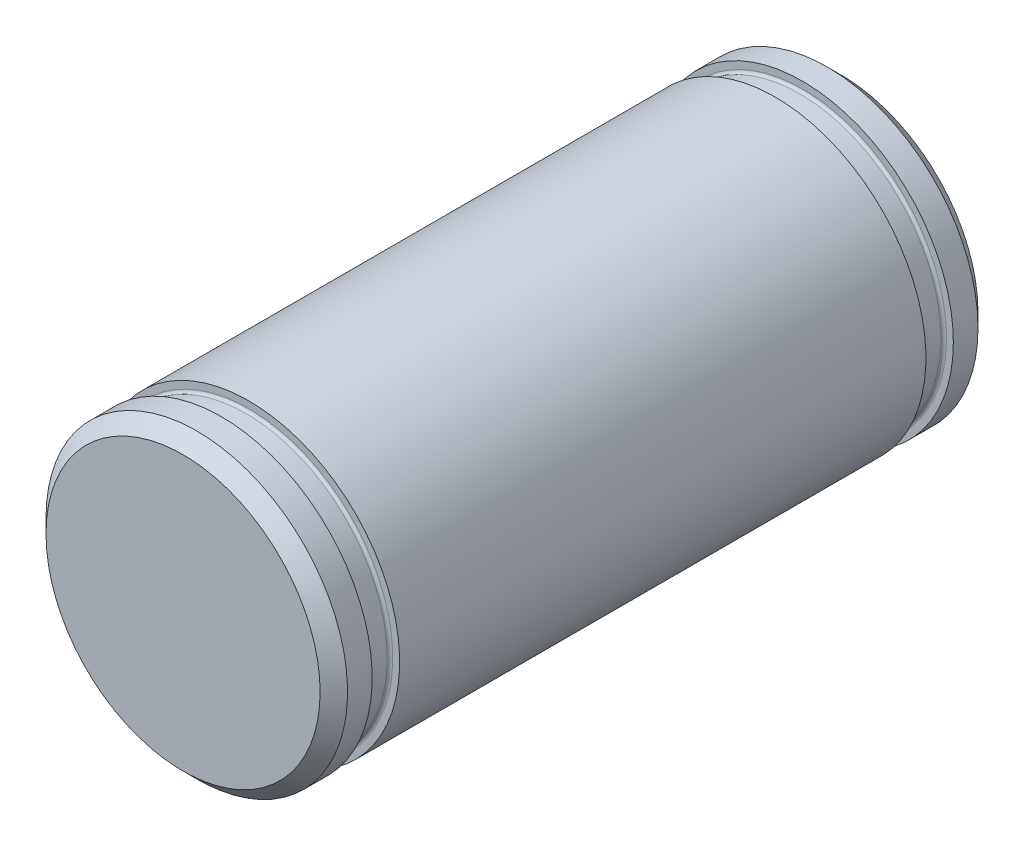
ISO-10303-21;
HEADER;
FILE_DESCRIPTION(('STEP AP214'),'2;1');
FILE_NAME('part.step','',(''),(''),'','','');
FILE_SCHEMA(('AUTOMOTIVE_DESIGN { 1 0 10303 214 1 1 1 1 }'));
ENDSEC;
DATA;
#1=APPLICATION_CONTEXT('core data for automotive mechanical design processes');
#2=APPLICATION_PROTOCOL_DEFINITION('international standard','automotive_design',2000,#1);
#3=PRODUCT_CONTEXT('',#1,'mechanical');
#4=PRODUCT('Part','Part','',(#3));
#5=PRODUCT_RELATED_PRODUCT_CATEGORY('part','',(#4));
#6=PRODUCT_DEFINITION_FORMATION('','',#4);
#7=PRODUCT_DEFINITION_CONTEXT('part definition',#1,'design');
#8=PRODUCT_DEFINITION('design','',#6,#7);
#9=PRODUCT_DEFINITION_SHAPE('','',#8);
#10=(LENGTH_UNIT() NAMED_UNIT(*) SI_UNIT(.MILLI.,.METRE.));
#11=(NAMED_UNIT(*) PLANE_ANGLE_UNIT() SI_UNIT($,.RADIAN.));
#12=(NAMED_UNIT(*) SI_UNIT($,.STERADIAN.) SOLID_ANGLE_UNIT());
#13=UNCERTAINTY_MEASURE_WITH_UNIT(LENGTH_MEASURE(1.E-05),#10,'distance_accuracy_value','');
#14=(GEOMETRIC_REPRESENTATION_CONTEXT(3) GLOBAL_UNCERTAINTY_ASSIGNED_CONTEXT((#13)) GLOBAL_UNIT_ASSIGNED_CONTEXT((#10,
#11,#12)) REPRESENTATION_CONTEXT('',''));
#15=CARTESIAN_POINT('',(0.,0.,0.));
#16=DIRECTION('',(0.,0.,1.));
#17=DIRECTION('',(1.,0.,0.));
#18=AXIS2_PLACEMENT_3D('',#15,#16,#17);
#19=CARTESIAN_POINT('',(0.,0.,12.));
#20=DIRECTION('',(0.,0.,-1.));
#21=DIRECTION('',(-1.,0.,0.));
#22=AXIS2_PLACEMENT_3D('',#19,#20,#21);
#23=CYLINDRICAL_SURFACE('',#22,5.5);
#24=CARTESIAN_POINT('',(0.,0.,9.6));
#25=DIRECTION('',(0.,0.,1.));
#26=DIRECTION('',(1.,0.,0.));
#27=AXIS2_PLACEMENT_3D('',#24,#25,#26);
#28=CIRCLE('',#27,5.5);
#29=CARTESIAN_POINT('',(-5.50000000000001,0.,9.6));
#30=VERTEX_POINT('',#29);
#31=EDGE_CURVE('E48',#30,#30,#28,.T.);
#32=CARTESIAN_POINT('',(0.,0.,-9.59999999999998));
#33=DIRECTION('',(0.,0.,-1.));
#34=DIRECTION('',(-1.,0.,0.));
#35=AXIS2_PLACEMENT_3D('',#32,#33,#34);
#36=CIRCLE('',#35,5.5);
#37=CARTESIAN_POINT('',(-5.50000000000001,0.,-9.59999999999999));
#38=VERTEX_POINT('',#37);
#39=EDGE_CURVE('E55',#38,#38,#36,.T.);
#40=CARTESIAN_POINT('',(-5.50000000000001,0.,9.6));
#41=CARTESIAN_POINT('',(-5.50000000000001,0.,9.4));
#42=CARTESIAN_POINT('',(-5.50000000000001,0.,9.2));
#43=CARTESIAN_POINT('',(-5.50000000000001,0.,8.8));
#44=CARTESIAN_POINT('',(-5.50000000000001,0.,8.6));
#45=CARTESIAN_POINT('',(-5.50000000000001,0.,8.2));
#46=CARTESIAN_POINT('',(-5.50000000000001,0.,8.));
#47=CARTESIAN_POINT('',(-5.50000000000001,0.,7.6));
#48=CARTESIAN_POINT('',(-5.50000000000001,0.,7.4));
#49=CARTESIAN_POINT('',(-5.50000000000001,0.,7.));
#50=CARTESIAN_POINT('',(-5.50000000000001,0.,6.8));
#51=CARTESIAN_POINT('',(-5.50000000000001,0.,6.4));
#52=CARTESIAN_POINT('',(-5.50000000000001,0.,6.2));
#53=CARTESIAN_POINT('',(-5.50000000000001,0.,5.8));
#54=CARTESIAN_POINT('',(-5.50000000000001,0.,5.6));
#55=CARTESIAN_POINT('',(-5.50000000000001,0.,5.2));
#56=CARTESIAN_POINT('',(-5.50000000000001,0.,5.));
#57=CARTESIAN_POINT('',(-5.50000000000001,0.,4.6));
#58=CARTESIAN_POINT('',(-5.50000000000001,0.,4.4));
#59=CARTESIAN_POINT('',(-5.50000000000001,0.,4.));
#60=CARTESIAN_POINT('',(-5.50000000000001,0.,3.8));
#61=CARTESIAN_POINT('',(-5.50000000000001,0.,3.4));
#62=CARTESIAN_POINT('',(-5.50000000000001,0.,3.2));
#63=CARTESIAN_POINT('',(-5.50000000000001,0.,2.8));
#64=CARTESIAN_POINT('',(-5.50000000000001,0.,2.6));
#65=CARTESIAN_POINT('',(-5.50000000000001,0.,2.2));
#66=CARTESIAN_POINT('',(-5.50000000000001,0.,2.));
#67=CARTESIAN_POINT('',(-5.50000000000001,0.,1.6));
#68=CARTESIAN_POINT('',(-5.50000000000001,0.,1.4));
#69=CARTESIAN_POINT('',(-5.50000000000001,0.,1.));
#70=CARTESIAN_POINT('',(-5.50000000000001,0.,0.800000000000003));
#71=CARTESIAN_POINT('',(-5.50000000000001,0.,0.400000000000003));
#72=CARTESIAN_POINT('',(-5.50000000000001,0.,0.200000000000003));
#73=CARTESIAN_POINT('',(-5.50000000000001,0.,-0.199999999999996));
#74=CARTESIAN_POINT('',(-5.50000000000001,0.,-0.399999999999996));
#75=CARTESIAN_POINT('',(-5.50000000000001,0.,-0.799999999999996));
#76=CARTESIAN_POINT('',(-5.50000000000001,0.,-0.999999999999996));
#77=CARTESIAN_POINT('',(-5.50000000000001,0.,-1.4));
#78=CARTESIAN_POINT('',(-5.50000000000001,0.,-1.59999999999999));
#79=CARTESIAN_POINT('',(-5.50000000000001,0.,-1.99999999999999));
#80=CARTESIAN_POINT('',(-5.50000000000001,0.,-2.19999999999999));
#81=CARTESIAN_POINT('',(-5.50000000000001,0.,-2.59999999999999));
#82=CARTESIAN_POINT('',(-5.50000000000001,0.,-2.79999999999999));
#83=CARTESIAN_POINT('',(-5.50000000000001,0.,-3.19999999999999));
#84=CARTESIAN_POINT('',(-5.50000000000001,0.,-3.39999999999999));
#85=CARTESIAN_POINT('',(-5.50000000000001,0.,-3.79999999999999));
#86=CARTESIAN_POINT('',(-5.50000000000001,0.,-3.99999999999999));
#87=CARTESIAN_POINT('',(-5.50000000000001,0.,-4.39999999999999));
#88=CARTESIAN_POINT('',(-5.50000000000001,0.,-4.59999999999999));
#89=CARTESIAN_POINT('',(-5.50000000000001,0.,-4.99999999999999));
#90=CARTESIAN_POINT('',(-5.50000000000001,0.,-5.19999999999999));
#91=CARTESIAN_POINT('',(-5.50000000000001,0.,-5.59999999999999));
#92=CARTESIAN_POINT('',(-5.50000000000001,0.,-5.79999999999999));
#93=CARTESIAN_POINT('',(-5.50000000000001,0.,-6.19999999999999));
#94=CARTESIAN_POINT('',(-5.50000000000001,0.,-6.39999999999999));
#95=CARTESIAN_POINT('',(-5.50000000000001,0.,-6.79999999999999));
#96=CARTESIAN_POINT('',(-5.50000000000001,0.,-6.99999999999999));
#97=CARTESIAN_POINT('',(-5.50000000000001,0.,-7.39999999999999));
#98=CARTESIAN_POINT('',(-5.50000000000001,0.,-7.59999999999999));
#99=CARTESIAN_POINT('',(-5.50000000000001,0.,-7.99999999999999));
#100=CARTESIAN_POINT('',(-5.50000000000001,0.,-8.19999999999999));
#101=CARTESIAN_POINT('',(-5.50000000000001,0.,-8.59999999999999));
#102=CARTESIAN_POINT('',(-5.50000000000001,0.,-8.79999999999999));
#103=CARTESIAN_POINT('',(-5.50000000000001,0.,-9.19999999999999));
#104=CARTESIAN_POINT('',(-5.50000000000001,0.,-9.39999999999999));
#105=CARTESIAN_POINT('',(-5.50000000000001,0.,-9.59999999999999));
#106=B_SPLINE_CURVE_WITH_KNOTS('',3,(#40,#41,#42,#43,#44,#45,#46,#47,#48,#49,#50,#51,#52,#53,
#54,#55,#56,#57,#58,#59,#60,#61,#62,#63,#64,#65,#66,#67,#68,#69,#70,#71,#72,#73,#74,#75,#76,#77,
#78,#79,#80,#81,#82,#83,#84,#85,#86,#87,#88,#89,#90,#91,#92,#93,#94,#95,#96,#97,#98,#99,#100,
#101,#102,#103,#104,#105),.UNSPECIFIED.,.F.,.F.,(4,2,2,2,2,2,2,2,2,2,2,2,2,2,2,2,2,2,2,2,2,2,2,
2,2,2,2,2,2,2,2,2,4),(0.,0.6,1.2,1.8,2.4,3.,3.6,4.2,4.8,5.4,6.,6.6,7.2,7.79999999999999,8.4,
8.99999999999999,9.59999999999999,10.2,10.8,11.4,12.,12.6,13.2,13.8,14.4,15.,15.6,16.2,16.8,
17.4,18.,18.6,19.2),.UNSPECIFIED.);
#107=EDGE_CURVE('BSEAM31',#30,#38,#106,.T.);
#108=ORIENTED_EDGE('',*,*,#31,.F.);
#109=ORIENTED_EDGE('',*,*,#39,.F.);
#110=ORIENTED_EDGE('',*,*,#107,.T.);
#111=ORIENTED_EDGE('',*,*,#107,.F.);
#112=EDGE_LOOP('',(#108,#110,#109,#111));
#113=FACE_BOUND('',#112,.T.);
#114=ADVANCED_FACE('F31',(#113),#23,.T.);
#115=CARTESIAN_POINT('',(0.,0.,11.5));
#116=DIRECTION('',(0.,0.,1.));
#117=DIRECTION('',(1.,0.,0.));
#118=AXIS2_PLACEMENT_3D('',#115,#116,#117);
#119=CIRCLE('',#118,5.5);
#120=CARTESIAN_POINT('',(-5.50000000000001,0.,11.5));
#121=VERTEX_POINT('',#120);
#122=EDGE_CURVE('E44',#121,#121,#119,.F.);
#123=CARTESIAN_POINT('',(0.,0.,10.6));
#124=DIRECTION('',(0.,0.,-1.));
#125=DIRECTION('',(-1.,0.,0.));
#126=AXIS2_PLACEMENT_3D('',#123,#124,#125);
#127=CIRCLE('',#126,5.5);
#128=CARTESIAN_POINT('',(-5.50000000000001,0.,10.6));
#129=VERTEX_POINT('',#128);
#130=EDGE_CURVE('E51',#129,#129,#127,.T.);
#131=CARTESIAN_POINT('',(-5.50000000000001,0.,11.5));
#132=CARTESIAN_POINT('',(-5.50000000000001,0.,11.490625));
#133=CARTESIAN_POINT('',(-5.50000000000001,0.,11.48125));
#134=CARTESIAN_POINT('',(-5.50000000000001,0.,11.4625));
#135=CARTESIAN_POINT('',(-5.50000000000001,0.,11.453125));
#136=CARTESIAN_POINT('',(-5.50000000000001,0.,11.434375));
#137=CARTESIAN_POINT('',(-5.50000000000001,0.,11.425));
#138=CARTESIAN_POINT('',(-5.50000000000001,0.,11.40625));
#139=CARTESIAN_POINT('',(-5.50000000000001,0.,11.396875));
#140=CARTESIAN_POINT('',(-5.50000000000001,0.,11.378125));
#141=CARTESIAN_POINT('',(-5.50000000000001,0.,11.36875));
#142=CARTESIAN_POINT('',(-5.50000000000001,0.,11.35));
#143=CARTESIAN_POINT('',(-5.50000000000001,0.,11.340625));
#144=CARTESIAN_POINT('',(-5.50000000000001,0.,11.321875));
#145=CARTESIAN_POINT('',(-5.50000000000001,0.,11.3125));
#146=CARTESIAN_POINT('',(-5.50000000000001,0.,11.29375));
#147=CARTESIAN_POINT('',(-5.50000000000001,0.,11.284375));
#148=CARTESIAN_POINT('',(-5.50000000000001,0.,11.265625));
#149=CARTESIAN_POINT('',(-5.50000000000001,0.,11.25625));
#150=CARTESIAN_POINT('',(-5.50000000000001,0.,11.2375));
#151=CARTESIAN_POINT('',(-5.50000000000001,0.,11.228125));
#152=CARTESIAN_POINT('',(-5.50000000000001,0.,11.209375));
#153=CARTESIAN_POINT('',(-5.50000000000001,0.,11.2));
#154=CARTESIAN_POINT('',(-5.50000000000001,0.,11.18125));
#155=CARTESIAN_POINT('',(-5.50000000000001,0.,11.171875));
#156=CARTESIAN_POINT('',(-5.50000000000001,0.,11.153125));
#157=CARTESIAN_POINT('',(-5.50000000000001,0.,11.14375));
#158=CARTESIAN_POINT('',(-5.50000000000001,0.,11.125));
#159=CARTESIAN_POINT('',(-5.50000000000001,0.,11.115625));
#160=CARTESIAN_POINT('',(-5.50000000000001,0.,11.096875));
#161=CARTESIAN_POINT('',(-5.50000000000001,0.,11.0875));
#162=CARTESIAN_POINT('',(-5.50000000000001,0.,11.06875));
#163=CARTESIAN_POINT('',(-5.50000000000001,0.,11.059375));
#164=CARTESIAN_POINT('',(-5.50000000000001,0.,11.040625));
#165=CARTESIAN_POINT('',(-5.50000000000001,0.,11.03125));
#166=CARTESIAN_POINT('',(-5.50000000000001,0.,11.0125));
#167=CARTESIAN_POINT('',(-5.50000000000001,0.,11.003125));
#168=CARTESIAN_POINT('',(-5.50000000000001,0.,10.984375));
#169=CARTESIAN_POINT('',(-5.50000000000001,0.,10.975));
#170=CARTESIAN_POINT('',(-5.50000000000001,0.,10.95625));
#171=CARTESIAN_POINT('',(-5.50000000000001,0.,10.946875));
#172=CARTESIAN_POINT('',(-5.50000000000001,0.,10.928125));
#173=CARTESIAN_POINT('',(-5.50000000000001,0.,10.91875));
#174=CARTESIAN_POINT('',(-5.50000000000001,0.,10.9));
#175=CARTESIAN_POINT('',(-5.50000000000001,0.,10.890625));
#176=CARTESIAN_POINT('',(-5.50000000000001,0.,10.871875));
#177=CARTESIAN_POINT('',(-5.50000000000001,0.,10.8625));
#178=CARTESIAN_POINT('',(-5.50000000000001,0.,10.84375));
#179=CARTESIAN_POINT('',(-5.50000000000001,0.,10.834375));
#180=CARTESIAN_POINT('',(-5.50000000000001,0.,10.815625));
#181=CARTESIAN_POINT('',(-5.50000000000001,0.,10.80625));
#182=CARTESIAN_POINT('',(-5.50000000000001,0.,10.7875));
#183=CARTESIAN_POINT('',(-5.50000000000001,0.,10.778125));
#184=CARTESIAN_POINT('',(-5.50000000000001,0.,10.759375));
#185=CARTESIAN_POINT('',(-5.50000000000001,0.,10.75));
#186=CARTESIAN_POINT('',(-5.50000000000001,0.,10.73125));
#187=CARTESIAN_POINT('',(-5.50000000000001,0.,10.721875));
#188=CARTESIAN_POINT('',(-5.50000000000001,0.,10.703125));
#189=CARTESIAN_POINT('',(-5.50000000000001,0.,10.69375));
#190=CARTESIAN_POINT('',(-5.50000000000001,0.,10.675));
#191=CARTESIAN_POINT('',(-5.50000000000001,0.,10.665625));
#192=CARTESIAN_POINT('',(-5.50000000000001,0.,10.646875));
#193=CARTESIAN_POINT('',(-5.50000000000001,0.,10.6375));
#194=CARTESIAN_POINT('',(-5.50000000000001,0.,10.61875));
#195=CARTESIAN_POINT('',(-5.50000000000001,0.,10.609375));
#196=CARTESIAN_POINT('',(-5.50000000000001,0.,10.6));
#197=B_SPLINE_CURVE_WITH_KNOTS('',3,(#131,#132,#133,#134,#135,#136,#137,#138,#139,#140,#141,
#142,#143,#144,#145,#146,#147,#148,#149,#150,#151,#152,#153,#154,#155,#156,#157,#158,#159,#160,
#161,#162,#163,#164,#165,#166,#167,#168,#169,#170,#171,#172,#173,#174,#175,#176,#177,#178,#179,
#180,#181,#182,#183,#184,#185,#186,#187,#188,#189,#190,#191,#192,#193,#194,#195,#196),
.UNSPECIFIED.,.F.,.F.,(4,2,2,2,2,2,2,2,2,2,2,2,2,2,2,2,2,2,2,2,2,2,2,2,2,2,2,2,2,2,2,2,4),(0.,
0.0281250000000004,0.0562500000000007,0.0843750000000011,0.112500000000001,0.140625,
0.168750000000001,0.196875000000001,0.225000000000001,0.253125,0.28125,0.309375000000001,
0.337500000000001,0.365625,0.39375,0.421875,0.450000000000001,0.478124999999999,0.50625,
0.534375,0.5625,0.590624999999999,0.618749999999999,0.646875,0.675,0.703124999999999,
0.731249999999999,0.759375,0.7875,0.815624999999999,0.843749999999999,0.871874999999999,0.9),.UNSPECIFIED.);
#198=EDGE_CURVE('BSEAM86',#121,#129,#197,.T.);
#199=ORIENTED_EDGE('',*,*,#122,.T.);
#200=ORIENTED_EDGE('',*,*,#130,.F.);
#201=ORIENTED_EDGE('',*,*,#198,.T.);
#202=ORIENTED_EDGE('',*,*,#198,.F.);
#203=EDGE_LOOP('',(#199,#201,#200,#202));
#204=FACE_BOUND('',#203,.T.);
#205=ADVANCED_FACE('F86',(#204),#23,.T.);
#206=CARTESIAN_POINT('',(0.,0.,12.));
#207=DIRECTION('',(0.,0.,1.));
#208=DIRECTION('',(1.,0.,0.));
#209=AXIS2_PLACEMENT_3D('',#206,#207,#208);
#210=PLANE('',#209);
#211=CARTESIAN_POINT('',(0.,0.,12.));
#212=DIRECTION('',(0.,0.,1.));
#213=DIRECTION('',(1.,0.,0.));
#214=AXIS2_PLACEMENT_3D('',#211,#212,#213);
#215=CIRCLE('',#214,5.);
#216=CARTESIAN_POINT('',(-5.00000000000001,0.,12.));
#217=VERTEX_POINT('',#216);
#218=EDGE_CURVE('E54',#217,#217,#215,.T.);
#219=ORIENTED_EDGE('',*,*,#218,.T.);
#220=EDGE_LOOP('',(#219));
#221=FACE_BOUND('',#220,.T.);
#222=ADVANCED_FACE('F93',(#221),#210,.T.);
#223=CARTESIAN_POINT('',(0.,0.,12.));
#224=DIRECTION('',(0.,0.,-1.));
#225=DIRECTION('',(-1.,0.,0.));
#226=AXIS2_PLACEMENT_3D('',#223,#224,#225);
#227=CONICAL_SURFACE('',#226,5.,0.785398163397447);
#228=CARTESIAN_POINT('',(-5.50000000000001,0.,11.5));
#229=CARTESIAN_POINT('',(-5.49479166666667,0.,11.5052083333333));
#230=CARTESIAN_POINT('',(-5.48958333333334,0.,11.5104166666667));
#231=CARTESIAN_POINT('',(-5.47916666666667,0.,11.5208333333333));
#232=CARTESIAN_POINT('',(-5.47395833333334,0.,11.5260416666667));
#233=CARTESIAN_POINT('',(-5.46354166666667,0.,11.5364583333333));
#234=CARTESIAN_POINT('',(-5.45833333333334,0.,11.5416666666667));
#235=CARTESIAN_POINT('',(-5.44791666666667,0.,11.5520833333333));
#236=CARTESIAN_POINT('',(-5.44270833333334,0.,11.5572916666667));
#237=CARTESIAN_POINT('',(-5.43229166666667,0.,11.5677083333333));
#238=CARTESIAN_POINT('',(-5.42708333333334,0.,11.5729166666667));
#239=CARTESIAN_POINT('',(-5.41666666666667,0.,11.5833333333333));
#240=CARTESIAN_POINT('',(-5.41145833333334,0.,11.5885416666667));
#241=CARTESIAN_POINT('',(-5.40104166666667,0.,11.5989583333333));
#242=CARTESIAN_POINT('',(-5.39583333333334,0.,11.6041666666667));
#243=CARTESIAN_POINT('',(-5.38541666666667,0.,11.6145833333333));
#244=CARTESIAN_POINT('',(-5.38020833333334,0.,11.6197916666667));
#245=CARTESIAN_POINT('',(-5.36979166666667,0.,11.6302083333333));
#246=CARTESIAN_POINT('',(-5.36458333333334,0.,11.6354166666667));
#247=CARTESIAN_POINT('',(-5.35416666666667,0.,11.6458333333333));
#248=CARTESIAN_POINT('',(-5.34895833333334,0.,11.6510416666667));
#249=CARTESIAN_POINT('',(-5.33854166666667,0.,11.6614583333333));
#250=CARTESIAN_POINT('',(-5.33333333333334,0.,11.6666666666667));
#251=CARTESIAN_POINT('',(-5.32291666666667,0.,11.6770833333333));
#252=CARTESIAN_POINT('',(-5.31770833333334,0.,11.6822916666667));
#253=CARTESIAN_POINT('',(-5.30729166666667,0.,11.6927083333333));
#254=CARTESIAN_POINT('',(-5.30208333333334,0.,11.6979166666667));
#255=CARTESIAN_POINT('',(-5.29166666666667,0.,11.7083333333333));
#256=CARTESIAN_POINT('',(-5.28645833333334,0.,11.7135416666667));
#257=CARTESIAN_POINT('',(-5.27604166666667,0.,11.7239583333333));
#258=CARTESIAN_POINT('',(-5.27083333333334,0.,11.7291666666667));
#259=CARTESIAN_POINT('',(-5.26041666666667,0.,11.7395833333333));
#260=CARTESIAN_POINT('',(-5.25520833333334,0.,11.7447916666667));
#261=CARTESIAN_POINT('',(-5.24479166666667,0.,11.7552083333333));
#262=CARTESIAN_POINT('',(-5.23958333333334,0.,11.7604166666667));
#263=CARTESIAN_POINT('',(-5.22916666666667,0.,11.7708333333333));
#264=CARTESIAN_POINT('',(-5.22395833333334,0.,11.7760416666667));
#265=CARTESIAN_POINT('',(-5.21354166666667,0.,11.7864583333333));
#266=CARTESIAN_POINT('',(-5.20833333333334,0.,11.7916666666667));
#267=CARTESIAN_POINT('',(-5.19791666666667,0.,11.8020833333333));
#268=CARTESIAN_POINT('',(-5.19270833333334,0.,11.8072916666667));
#269=CARTESIAN_POINT('',(-5.18229166666667,0.,11.8177083333333));
#270=CARTESIAN_POINT('',(-5.17708333333334,0.,11.8229166666667));
#271=CARTESIAN_POINT('',(-5.16666666666667,0.,11.8333333333333));
#272=CARTESIAN_POINT('',(-5.16145833333334,0.,11.8385416666667));
#273=CARTESIAN_POINT('',(-5.15104166666667,0.,11.8489583333333));
#274=CARTESIAN_POINT('',(-5.14583333333334,0.,11.8541666666667));
#275=CARTESIAN_POINT('',(-5.13541666666667,0.,11.8645833333333));
#276=CARTESIAN_POINT('',(-5.13020833333334,0.,11.8697916666667));
#277=CARTESIAN_POINT('',(-5.11979166666667,0.,11.8802083333333));
#278=CARTESIAN_POINT('',(-5.11458333333334,0.,11.8854166666667));
#279=CARTESIAN_POINT('',(-5.10416666666667,0.,11.8958333333333));
#280=CARTESIAN_POINT('',(-5.09895833333334,0.,11.9010416666667));
#281=CARTESIAN_POINT('',(-5.08854166666667,0.,11.9114583333333));
#282=CARTESIAN_POINT('',(-5.08333333333334,0.,11.9166666666667));
#283=CARTESIAN_POINT('',(-5.07291666666667,0.,11.9270833333333));
#284=CARTESIAN_POINT('',(-5.06770833333334,0.,11.9322916666667));
#285=CARTESIAN_POINT('',(-5.05729166666667,0.,11.9427083333333));
#286=CARTESIAN_POINT('',(-5.05208333333334,0.,11.9479166666667));
#287=CARTESIAN_POINT('',(-5.04166666666667,0.,11.9583333333333));
#288=CARTESIAN_POINT('',(-5.03645833333334,0.,11.9635416666667));
#289=CARTESIAN_POINT('',(-5.02604166666667,0.,11.9739583333333));
#290=CARTESIAN_POINT('',(-5.02083333333334,0.,11.9791666666667));
#291=CARTESIAN_POINT('',(-5.01041666666667,0.,11.9895833333333));
#292=CARTESIAN_POINT('',(-5.00520833333334,0.,11.9947916666667));
#293=CARTESIAN_POINT('',(-5.00000000000001,0.,12.));
#294=B_SPLINE_CURVE_WITH_KNOTS('',3,(#228,#229,#230,#231,#232,#233,#234,#235,#236,#237,#238,
#239,#240,#241,#242,#243,#244,#245,#246,#247,#248,#249,#250,#251,#252,#253,#254,#255,#256,#257,
#258,#259,#260,#261,#262,#263,#264,#265,#266,#267,#268,#269,#270,#271,#272,#273,#274,#275,#276,
#277,#278,#279,#280,#281,#282,#283,#284,#285,#286,#287,#288,#289,#290,#291,#292,#293),
.UNSPECIFIED.,.F.,.F.,(4,2,2,2,2,2,2,2,2,2,2,2,2,2,2,2,2,2,2,2,2,2,2,2,2,2,2,2,2,2,2,2,4),(0.,
0.0220970869120784,0.0441941738241593,0.0662912607362377,0.0883883476483185,0.110485434560397,
0.132582521472477,0.154679608384556,0.176776695296636,0.198873782208715,0.220970869120796,
0.243067956032875,0.265165042944955,0.287262129857033,0.309359216769114,0.331456303681193,
0.353553390593273,0.375650477505352,0.397747564417433,0.419844651329511,0.441941738241591,
0.464038825153671,0.486135912065751,0.50823299897783,0.53033008588991,0.552427172801988,
0.574524259714068,0.596621346626148,0.618718433538228,0.640815520450308,0.662912607362388,
0.685009694274467,0.707106781186547),.UNSPECIFIED.);
#295=EDGE_CURVE('BSEAM89',#121,#217,#294,.T.);
#296=ORIENTED_EDGE('',*,*,#122,.F.);
#297=ORIENTED_EDGE('',*,*,#218,.F.);
#298=ORIENTED_EDGE('',*,*,#295,.T.);
#299=ORIENTED_EDGE('',*,*,#295,.F.);
#300=EDGE_LOOP('',(#296,#298,#297,#299));
#301=FACE_BOUND('',#300,.T.);
#302=ADVANCED_FACE('F89',(#301),#227,.T.);
#303=CARTESIAN_POINT('',(0.,5.25,10.6));
#304=DIRECTION('',(0.,0.,-1.));
#305=DIRECTION('',(-1.,0.,0.));
#306=AXIS2_PLACEMENT_3D('',#303,#304,#305);
#307=PLANE('',#306);
#308=CARTESIAN_POINT('',(0.,0.,10.6));
#309=DIRECTION('',(0.,0.,-1.));
#310=DIRECTION('',(-1.,0.,0.));
#311=AXIS2_PLACEMENT_3D('',#308,#309,#310);
#312=CIRCLE('',#311,5.25);
#313=CARTESIAN_POINT('',(-5.25000000000001,0.,10.6));
#314=VERTEX_POINT('',#313);
#315=EDGE_CURVE('E52',#314,#314,#312,.T.);
#316=ORIENTED_EDGE('',*,*,#315,.F.);
#317=EDGE_LOOP('',(#316));
#318=FACE_BOUND('',#317,.T.);
#319=ORIENTED_EDGE('',*,*,#130,.T.);
#320=EDGE_LOOP('',(#319));
#321=FACE_BOUND('',#320,.T.);
#322=ADVANCED_FACE('F92',(#318,#321),#307,.T.);
#323=CARTESIAN_POINT('',(0.,6.6,9.6));
#324=DIRECTION('',(0.,0.,1.));
#325=DIRECTION('',(1.,0.,0.));
#326=AXIS2_PLACEMENT_3D('',#323,#324,#325);
#327=PLANE('',#326);
#328=CARTESIAN_POINT('',(0.,0.,9.59999999999999));
#329=DIRECTION('',(0.,0.,-1.));
#330=DIRECTION('',(-1.,0.,0.));
#331=AXIS2_PLACEMENT_3D('',#328,#329,#330);
#332=CIRCLE('',#331,5.25);
#333=CARTESIAN_POINT('',(-5.25000000000001,0.,9.59999999999999));
#334=VERTEX_POINT('',#333);
#335=EDGE_CURVE('E61',#334,#334,#332,.T.);
#336=ORIENTED_EDGE('',*,*,#335,.T.);
#337=EDGE_LOOP('',(#336));
#338=FACE_BOUND('',#337,.T.);
#339=ORIENTED_EDGE('',*,*,#31,.T.);
#340=EDGE_LOOP('',(#339));
#341=FACE_BOUND('',#340,.T.);
#342=ADVANCED_FACE('F140',(#338,#341),#327,.T.);
#343=CARTESIAN_POINT('',(0.,0.,10.5));
#344=DIRECTION('',(0.,0.,-1.));
#345=DIRECTION('',(-1.,0.,0.));
#346=AXIS2_PLACEMENT_3D('',#343,#344,#345);
#347=TOROIDAL_SURFACE('',#346,5.25,0.100000000000001);
#348=ORIENTED_EDGE('',*,*,#315,.T.);
#349=EDGE_LOOP('',(#348));
#350=FACE_BOUND('',#349,.T.);
#351=CARTESIAN_POINT('',(0.,0.,10.5));
#352=DIRECTION('',(0.,0.,-1.));
#353=DIRECTION('',(-1.,0.,0.));
#354=AXIS2_PLACEMENT_3D('',#351,#352,#353);
#355=CIRCLE('',#354,5.15);
#356=CARTESIAN_POINT('',(-5.15000000000001,0.,10.5));
#357=VERTEX_POINT('',#356);
#358=EDGE_CURVE('E77',#357,#357,#355,.T.);
#359=ORIENTED_EDGE('',*,*,#358,.F.);
#360=EDGE_LOOP('',(#359));
#361=FACE_BOUND('',#360,.T.);
#362=ADVANCED_FACE('F142',(#350,#361),#347,.F.);
#363=CARTESIAN_POINT('',(0.,0.,74.));
#364=DIRECTION('',(0.,0.,-1.));
#365=DIRECTION('',(-1.,0.,0.));
#366=AXIS2_PLACEMENT_3D('',#363,#364,#365);
#367=CYLINDRICAL_SURFACE('',#366,5.15);
#368=CARTESIAN_POINT('',(0.,0.,9.69999999999999));
#369=DIRECTION('',(0.,0.,-1.));
#370=DIRECTION('',(-1.,0.,0.));
#371=AXIS2_PLACEMENT_3D('',#368,#369,#370);
#372=CIRCLE('',#371,5.15);
#373=CARTESIAN_POINT('',(-5.15000000000001,0.,9.69999999999999));
#374=VERTEX_POINT('',#373);
#375=EDGE_CURVE('E74',#374,#374,#372,.T.);
#376=CARTESIAN_POINT('',(-5.15000000000001,0.,10.5));
#377=CARTESIAN_POINT('',(-5.15000000000001,0.,10.4916666666667));
#378=CARTESIAN_POINT('',(-5.15000000000001,0.,10.4833333333333));
#379=CARTESIAN_POINT('',(-5.15000000000001,0.,10.4666666666667));
#380=CARTESIAN_POINT('',(-5.15000000000001,0.,10.4583333333333));
#381=CARTESIAN_POINT('',(-5.15000000000001,0.,10.4416666666667));
#382=CARTESIAN_POINT('',(-5.15000000000001,0.,10.4333333333333));
#383=CARTESIAN_POINT('',(-5.15000000000001,0.,10.4166666666667));
#384=CARTESIAN_POINT('',(-5.15000000000001,0.,10.4083333333333));
#385=CARTESIAN_POINT('',(-5.15000000000001,0.,10.3916666666667));
#386=CARTESIAN_POINT('',(-5.15000000000001,0.,10.3833333333333));
#387=CARTESIAN_POINT('',(-5.15000000000001,0.,10.3666666666667));
#388=CARTESIAN_POINT('',(-5.15000000000001,0.,10.3583333333333));
#389=CARTESIAN_POINT('',(-5.15000000000001,0.,10.3416666666667));
#390=CARTESIAN_POINT('',(-5.15000000000001,0.,10.3333333333333));
#391=CARTESIAN_POINT('',(-5.15000000000001,0.,10.3166666666667));
#392=CARTESIAN_POINT('',(-5.15000000000001,0.,10.3083333333333));
#393=CARTESIAN_POINT('',(-5.15000000000001,0.,10.2916666666667));
#394=CARTESIAN_POINT('',(-5.15000000000001,0.,10.2833333333333));
#395=CARTESIAN_POINT('',(-5.15000000000001,0.,10.2666666666667));
#396=CARTESIAN_POINT('',(-5.15000000000001,0.,10.2583333333333));
#397=CARTESIAN_POINT('',(-5.15000000000001,0.,10.2416666666667));
#398=CARTESIAN_POINT('',(-5.15000000000001,0.,10.2333333333333));
#399=CARTESIAN_POINT('',(-5.15000000000001,0.,10.2166666666667));
#400=CARTESIAN_POINT('',(-5.15000000000001,0.,10.2083333333333));
#401=CARTESIAN_POINT('',(-5.15000000000001,0.,10.1916666666667));
#402=CARTESIAN_POINT('',(-5.15000000000001,0.,10.1833333333333));
#403=CARTESIAN_POINT('',(-5.15000000000001,0.,10.1666666666667));
#404=CARTESIAN_POINT('',(-5.15000000000001,0.,10.1583333333333));
#405=CARTESIAN_POINT('',(-5.15000000000001,0.,10.1416666666667));
#406=CARTESIAN_POINT('',(-5.15000000000001,0.,10.1333333333333));
#407=CARTESIAN_POINT('',(-5.15000000000001,0.,10.1166666666667));
#408=CARTESIAN_POINT('',(-5.15000000000001,0.,10.1083333333333));
#409=CARTESIAN_POINT('',(-5.15000000000001,0.,10.0916666666667));
#410=CARTESIAN_POINT('',(-5.15000000000001,0.,10.0833333333333));
#411=CARTESIAN_POINT('',(-5.15000000000001,0.,10.0666666666667));
#412=CARTESIAN_POINT('',(-5.15000000000001,0.,10.0583333333333));
#413=CARTESIAN_POINT('',(-5.15000000000001,0.,10.0416666666667));
#414=CARTESIAN_POINT('',(-5.15000000000001,0.,10.0333333333333));
#415=CARTESIAN_POINT('',(-5.15000000000001,0.,10.0166666666667));
#416=CARTESIAN_POINT('',(-5.15000000000001,0.,10.0083333333333));
#417=CARTESIAN_POINT('',(-5.15000000000001,0.,9.99166666666666));
#418=CARTESIAN_POINT('',(-5.15000000000001,0.,9.98333333333333));
#419=CARTESIAN_POINT('',(-5.15000000000001,0.,9.96666666666666));
#420=CARTESIAN_POINT('',(-5.15000000000001,0.,9.95833333333333));
#421=CARTESIAN_POINT('',(-5.15000000000001,0.,9.94166666666665));
#422=CARTESIAN_POINT('',(-5.15000000000001,0.,9.93333333333332));
#423=CARTESIAN_POINT('',(-5.15000000000001,0.,9.91666666666666));
#424=CARTESIAN_POINT('',(-5.15000000000001,0.,9.90833333333332));
#425=CARTESIAN_POINT('',(-5.15000000000001,0.,9.89166666666666));
#426=CARTESIAN_POINT('',(-5.15000000000001,0.,9.88333333333333));
#427=CARTESIAN_POINT('',(-5.15000000000001,0.,9.86666666666666));
#428=CARTESIAN_POINT('',(-5.15000000000001,0.,9.85833333333333));
#429=CARTESIAN_POINT('',(-5.15000000000001,0.,9.84166666666666));
#430=CARTESIAN_POINT('',(-5.15000000000001,0.,9.83333333333332));
#431=CARTESIAN_POINT('',(-5.15000000000001,0.,9.81666666666665));
#432=CARTESIAN_POINT('',(-5.15000000000001,0.,9.80833333333332));
#433=CARTESIAN_POINT('',(-5.15000000000001,0.,9.79166666666666));
#434=CARTESIAN_POINT('',(-5.15000000000001,0.,9.78333333333332));
#435=CARTESIAN_POINT('',(-5.15000000000001,0.,9.76666666666666));
#436=CARTESIAN_POINT('',(-5.15000000000001,0.,9.75833333333332));
#437=CARTESIAN_POINT('',(-5.15000000000001,0.,9.74166666666665));
#438=CARTESIAN_POINT('',(-5.15000000000001,0.,9.73333333333332));
#439=CARTESIAN_POINT('',(-5.15000000000001,0.,9.71666666666665));
#440=CARTESIAN_POINT('',(-5.15000000000001,0.,9.70833333333332));
#441=CARTESIAN_POINT('',(-5.15000000000001,0.,9.69999999999999));
#442=B_SPLINE_CURVE_WITH_KNOTS('',3,(#376,#377,#378,#379,#380,#381,#382,#383,#384,#385,#386,
#387,#388,#389,#390,#391,#392,#393,#394,#395,#396,#397,#398,#399,#400,#401,#402,#403,#404,#405,
#406,#407,#408,#409,#410,#411,#412,#413,#414,#415,#416,#417,#418,#419,#420,#421,#422,#423,#424,
#425,#426,#427,#428,#429,#430,#431,#432,#433,#434,#435,#436,#437,#438,#439,#440,#441),
.UNSPECIFIED.,.F.,.F.,(4,2,2,2,2,2,2,2,2,2,2,2,2,2,2,2,2,2,2,2,2,2,2,2,2,2,2,2,2,2,2,2,4),(0.,
0.0249999999999972,0.0499999999999945,0.0750000000000056,0.100000000000003,0.125,
0.150000000000011,0.175000000000008,0.200000000000006,0.225000000000003,0.25,0.275000000000011,
0.300000000000009,0.325000000000006,0.350000000000017,0.375000000000014,0.400000000000011,
0.425000000000009,0.450000000000006,0.475000000000017,0.500000000000014,0.525000000000012,
0.550000000000023,0.57500000000002,0.600000000000017,0.625000000000014,0.650000000000012,
0.675000000000023,0.70000000000002,0.725000000000017,0.750000000000028,0.775000000000026,
0.800000000000023),.UNSPECIFIED.);
#443=EDGE_CURVE('BSEAM134',#357,#374,#442,.T.);
#444=ORIENTED_EDGE('',*,*,#358,.T.);
#445=ORIENTED_EDGE('',*,*,#375,.F.);
#446=ORIENTED_EDGE('',*,*,#443,.T.);
#447=ORIENTED_EDGE('',*,*,#443,.F.);
#448=EDGE_LOOP('',(#444,#446,#445,#447));
#449=FACE_BOUND('',#448,.T.);
#450=ADVANCED_FACE('F134',(#449),#367,.T.);
#451=CARTESIAN_POINT('',(0.,0.,9.69999999999999));
#452=DIRECTION('',(0.,0.,-1.));
#453=DIRECTION('',(-1.,0.,0.));
#454=AXIS2_PLACEMENT_3D('',#451,#452,#453);
#455=TOROIDAL_SURFACE('',#454,5.25,0.0999999999999998);
#456=ORIENTED_EDGE('',*,*,#375,.T.);
#457=EDGE_LOOP('',(#456));
#458=FACE_BOUND('',#457,.T.);
#459=ORIENTED_EDGE('',*,*,#335,.F.);
#460=EDGE_LOOP('',(#459));
#461=FACE_BOUND('',#460,.T.);
#462=ADVANCED_FACE('F125',(#458,#461),#455,.F.);
#463=CARTESIAN_POINT('',(0.,5.25,-10.6));
#464=DIRECTION('',(0.,0.,1.));
#465=DIRECTION('',(-1.,0.,0.));
#466=AXIS2_PLACEMENT_3D('',#463,#464,#465);
#467=PLANE('',#466);
#468=CARTESIAN_POINT('',(0.,0.,-10.6));
#469=DIRECTION('',(0.,0.,-1.));
#470=DIRECTION('',(-1.,0.,0.));
#471=AXIS2_PLACEMENT_3D('',#468,#469,#470);
#472=CIRCLE('',#471,5.25);
#473=CARTESIAN_POINT('',(-5.25,0.,-10.6));
#474=VERTEX_POINT('',#473);
#475=EDGE_CURVE('E57',#474,#474,#472,.T.);
#476=ORIENTED_EDGE('',*,*,#475,.T.);
#477=EDGE_LOOP('',(#476));
#478=FACE_BOUND('',#477,.T.);
#479=CARTESIAN_POINT('',(0.,0.,-10.6));
#480=DIRECTION('',(0.,0.,1.));
#481=DIRECTION('',(1.,0.,0.));
#482=AXIS2_PLACEMENT_3D('',#479,#480,#481);
#483=CIRCLE('',#482,5.5);
#484=CARTESIAN_POINT('',(5.5,0.,-10.6));
#485=VERTEX_POINT('',#484);
#486=EDGE_CURVE('E35',#485,#485,#483,.T.);
#487=ORIENTED_EDGE('',*,*,#486,.T.);
#488=EDGE_LOOP('',(#487));
#489=FACE_BOUND('',#488,.T.);
#490=ADVANCED_FACE('F122',(#478,#489),#467,.T.);
#491=CARTESIAN_POINT('',(0.,6.59999999999999,-9.59999999999998));
#492=DIRECTION('',(0.,0.,-1.));
#493=DIRECTION('',(1.,0.,0.));
#494=AXIS2_PLACEMENT_3D('',#491,#492,#493);
#495=PLANE('',#494);
#496=CARTESIAN_POINT('',(0.,0.,-9.59999999999998));
#497=DIRECTION('',(0.,0.,-1.));
#498=DIRECTION('',(-1.,0.,0.));
#499=AXIS2_PLACEMENT_3D('',#496,#497,#498);
#500=CIRCLE('',#499,5.25);
#501=CARTESIAN_POINT('',(-5.25,0.,-9.59999999999998));
#502=VERTEX_POINT('',#501);
#503=EDGE_CURVE('E237',#502,#502,#500,.T.);
#504=ORIENTED_EDGE('',*,*,#503,.F.);
#505=EDGE_LOOP('',(#504));
#506=FACE_BOUND('',#505,.T.);
#507=ORIENTED_EDGE('',*,*,#39,.T.);
#508=EDGE_LOOP('',(#507));
#509=FACE_BOUND('',#508,.T.);
#510=ADVANCED_FACE('F124',(#506,#509),#495,.T.);
#511=CARTESIAN_POINT('',(0.,0.,-10.5));
#512=DIRECTION('',(0.,0.,1.));
#513=DIRECTION('',(-1.,0.,0.));
#514=AXIS2_PLACEMENT_3D('',#511,#512,#513);
#515=TOROIDAL_SURFACE('',#514,5.25,0.100000000000001);
#516=ORIENTED_EDGE('',*,*,#475,.F.);
#517=EDGE_LOOP('',(#516));
#518=FACE_BOUND('',#517,.T.);
#519=CARTESIAN_POINT('',(0.,0.,-10.5));
#520=DIRECTION('',(0.,0.,-1.));
#521=DIRECTION('',(-1.,0.,0.));
#522=AXIS2_PLACEMENT_3D('',#519,#520,#521);
#523=CIRCLE('',#522,5.15);
#524=CARTESIAN_POINT('',(-5.15000000000001,0.,-10.5));
#525=VERTEX_POINT('',#524);
#526=EDGE_CURVE('E63',#525,#525,#523,.T.);
#527=ORIENTED_EDGE('',*,*,#526,.T.);
#528=EDGE_LOOP('',(#527));
#529=FACE_BOUND('',#528,.T.);
#530=ADVANCED_FACE('F131',(#518,#529),#515,.F.);
#531=CARTESIAN_POINT('',(0.,0.,-74.));
#532=DIRECTION('',(0.,0.,1.));
#533=DIRECTION('',(-1.,0.,0.));
#534=AXIS2_PLACEMENT_3D('',#531,#532,#533);
#535=CYLINDRICAL_SURFACE('',#534,5.15);
#536=CARTESIAN_POINT('',(0.,0.,-9.69999999999999));
#537=DIRECTION('',(0.,0.,-1.));
#538=DIRECTION('',(-1.,0.,0.));
#539=AXIS2_PLACEMENT_3D('',#536,#537,#538);
#540=CIRCLE('',#539,5.15);
#541=CARTESIAN_POINT('',(-5.15000000000001,0.,-9.69999999999999));
#542=VERTEX_POINT('',#541);
#543=EDGE_CURVE('E68',#542,#542,#540,.T.);
#544=CARTESIAN_POINT('',(-5.15000000000001,0.,-10.5));
#545=CARTESIAN_POINT('',(-5.15000000000001,0.,-10.4916666666667));
#546=CARTESIAN_POINT('',(-5.15000000000001,0.,-10.4833333333333));
#547=CARTESIAN_POINT('',(-5.15000000000001,0.,-10.4666666666667));
#548=CARTESIAN_POINT('',(-5.15000000000001,0.,-10.4583333333333));
#549=CARTESIAN_POINT('',(-5.15000000000001,0.,-10.4416666666667));
#550=CARTESIAN_POINT('',(-5.15000000000001,0.,-10.4333333333333));
#551=CARTESIAN_POINT('',(-5.15000000000001,0.,-10.4166666666667));
#552=CARTESIAN_POINT('',(-5.15000000000001,0.,-10.4083333333333));
#553=CARTESIAN_POINT('',(-5.15000000000001,0.,-10.3916666666667));
#554=CARTESIAN_POINT('',(-5.15000000000001,0.,-10.3833333333333));
#555=CARTESIAN_POINT('',(-5.15000000000001,0.,-10.3666666666667));
#556=CARTESIAN_POINT('',(-5.15000000000001,0.,-10.3583333333333));
#557=CARTESIAN_POINT('',(-5.15000000000001,0.,-10.3416666666667));
#558=CARTESIAN_POINT('',(-5.15000000000001,0.,-10.3333333333333));
#559=CARTESIAN_POINT('',(-5.15000000000001,0.,-10.3166666666667));
#560=CARTESIAN_POINT('',(-5.15000000000001,0.,-10.3083333333333));
#561=CARTESIAN_POINT('',(-5.15000000000001,0.,-10.2916666666667));
#562=CARTESIAN_POINT('',(-5.15000000000001,0.,-10.2833333333333));
#563=CARTESIAN_POINT('',(-5.15000000000001,0.,-10.2666666666667));
#564=CARTESIAN_POINT('',(-5.15000000000001,0.,-10.2583333333333));
#565=CARTESIAN_POINT('',(-5.15000000000001,0.,-10.2416666666667));
#566=CARTESIAN_POINT('',(-5.15000000000001,0.,-10.2333333333333));
#567=CARTESIAN_POINT('',(-5.15000000000001,0.,-10.2166666666667));
#568=CARTESIAN_POINT('',(-5.15000000000001,0.,-10.2083333333333));
#569=CARTESIAN_POINT('',(-5.15000000000001,0.,-10.1916666666667));
#570=CARTESIAN_POINT('',(-5.15000000000001,0.,-10.1833333333333));
#571=CARTESIAN_POINT('',(-5.15000000000001,0.,-10.1666666666667));
#572=CARTESIAN_POINT('',(-5.15000000000001,0.,-10.1583333333333));
#573=CARTESIAN_POINT('',(-5.15000000000001,0.,-10.1416666666667));
#574=CARTESIAN_POINT('',(-5.15000000000001,0.,-10.1333333333333));
#575=CARTESIAN_POINT('',(-5.15000000000001,0.,-10.1166666666667));
#576=CARTESIAN_POINT('',(-5.15000000000001,0.,-10.1083333333333));
#577=CARTESIAN_POINT('',(-5.15000000000001,0.,-10.0916666666667));
#578=CARTESIAN_POINT('',(-5.15000000000001,0.,-10.0833333333333));
#579=CARTESIAN_POINT('',(-5.15000000000001,0.,-10.0666666666667));
#580=CARTESIAN_POINT('',(-5.15000000000001,0.,-10.0583333333333));
#581=CARTESIAN_POINT('',(-5.15000000000001,0.,-10.0416666666667));
#582=CARTESIAN_POINT('',(-5.15000000000001,0.,-10.0333333333333));
#583=CARTESIAN_POINT('',(-5.15000000000001,0.,-10.0166666666667));
#584=CARTESIAN_POINT('',(-5.15000000000001,0.,-10.0083333333333));
#585=CARTESIAN_POINT('',(-5.15000000000001,0.,-9.99166666666666));
#586=CARTESIAN_POINT('',(-5.15000000000001,0.,-9.98333333333333));
#587=CARTESIAN_POINT('',(-5.15000000000001,0.,-9.96666666666666));
#588=CARTESIAN_POINT('',(-5.15000000000001,0.,-9.95833333333333));
#589=CARTESIAN_POINT('',(-5.15000000000001,0.,-9.94166666666665));
#590=CARTESIAN_POINT('',(-5.15000000000001,0.,-9.93333333333332));
#591=CARTESIAN_POINT('',(-5.15000000000001,0.,-9.91666666666666));
#592=CARTESIAN_POINT('',(-5.15000000000001,0.,-9.90833333333332));
#593=CARTESIAN_POINT('',(-5.15000000000001,0.,-9.89166666666666));
#594=CARTESIAN_POINT('',(-5.15000000000001,0.,-9.88333333333333));
#595=CARTESIAN_POINT('',(-5.15000000000001,0.,-9.86666666666666));
#596=CARTESIAN_POINT('',(-5.15000000000001,0.,-9.85833333333333));
#597=CARTESIAN_POINT('',(-5.15000000000001,0.,-9.84166666666666));
#598=CARTESIAN_POINT('',(-5.15000000000001,0.,-9.83333333333332));
#599=CARTESIAN_POINT('',(-5.15000000000001,0.,-9.81666666666665));
#600=CARTESIAN_POINT('',(-5.15000000000001,0.,-9.80833333333332));
#601=CARTESIAN_POINT('',(-5.15000000000001,0.,-9.79166666666666));
#602=CARTESIAN_POINT('',(-5.15000000000001,0.,-9.78333333333332));
#603=CARTESIAN_POINT('',(-5.15000000000001,0.,-9.76666666666666));
#604=CARTESIAN_POINT('',(-5.15000000000001,0.,-9.75833333333332));
#605=CARTESIAN_POINT('',(-5.15000000000001,0.,-9.74166666666665));
#606=CARTESIAN_POINT('',(-5.15000000000001,0.,-9.73333333333332));
#607=CARTESIAN_POINT('',(-5.15000000000001,0.,-9.71666666666665));
#608=CARTESIAN_POINT('',(-5.15000000000001,0.,-9.70833333333332));
#609=CARTESIAN_POINT('',(-5.15000000000001,0.,-9.69999999999999));
#610=B_SPLINE_CURVE_WITH_KNOTS('',3,(#544,#545,#546,#547,#548,#549,#550,#551,#552,#553,#554,
#555,#556,#557,#558,#559,#560,#561,#562,#563,#564,#565,#566,#567,#568,#569,#570,#571,#572,#573,
#574,#575,#576,#577,#578,#579,#580,#581,#582,#583,#584,#585,#586,#587,#588,#589,#590,#591,#592,
#593,#594,#595,#596,#597,#598,#599,#600,#601,#602,#603,#604,#605,#606,#607,#608,#609),
.UNSPECIFIED.,.F.,.F.,(4,2,2,2,2,2,2,2,2,2,2,2,2,2,2,2,2,2,2,2,2,2,2,2,2,2,2,2,2,2,2,2,4),(0.,
0.0249999999999972,0.0499999999999945,0.0750000000000056,0.100000000000003,0.125,
0.150000000000011,0.175000000000008,0.200000000000006,0.225000000000003,0.25,0.275000000000011,
0.300000000000009,0.325000000000006,0.350000000000017,0.375000000000014,0.400000000000011,
0.425000000000009,0.450000000000006,0.475000000000017,0.500000000000014,0.525000000000012,
0.550000000000023,0.57500000000002,0.600000000000017,0.625000000000014,0.650000000000012,
0.675000000000023,0.70000000000002,0.725000000000017,0.750000000000028,0.775000000000026,
0.800000000000023),.UNSPECIFIED.);
#611=EDGE_CURVE('BSEAM200',#525,#542,#610,.T.);
#612=ORIENTED_EDGE('',*,*,#526,.F.);
#613=ORIENTED_EDGE('',*,*,#543,.T.);
#614=ORIENTED_EDGE('',*,*,#611,.T.);
#615=ORIENTED_EDGE('',*,*,#611,.F.);
#616=EDGE_LOOP('',(#612,#614,#613,#615));
#617=FACE_BOUND('',#616,.T.);
#618=ADVANCED_FACE('F200',(#617),#535,.T.);
#619=CARTESIAN_POINT('',(0.,0.,-9.69999999999999));
#620=DIRECTION('',(0.,0.,1.));
#621=DIRECTION('',(-1.,0.,0.));
#622=AXIS2_PLACEMENT_3D('',#619,#620,#621);
#623=TOROIDAL_SURFACE('',#622,5.25,0.0999999999999998);
#624=ORIENTED_EDGE('',*,*,#543,.F.);
#625=EDGE_LOOP('',(#624));
#626=FACE_BOUND('',#625,.T.);
#627=ORIENTED_EDGE('',*,*,#503,.T.);
#628=EDGE_LOOP('',(#627));
#629=FACE_BOUND('',#628,.T.);
#630=ADVANCED_FACE('F207',(#626,#629),#623,.F.);
#631=CARTESIAN_POINT('',(0.,0.,-12.));
#632=DIRECTION('',(0.,0.,1.));
#633=DIRECTION('',(1.,0.,0.));
#634=AXIS2_PLACEMENT_3D('',#631,#632,#633);
#635=PLANE('',#634);
#636=CARTESIAN_POINT('',(0.,0.,-12.));
#637=DIRECTION('',(0.,0.,1.));
#638=DIRECTION('',(1.,0.,0.));
#639=AXIS2_PLACEMENT_3D('',#636,#637,#638);
#640=CIRCLE('',#639,5.);
#641=CARTESIAN_POINT('',(5.,0.,-12.));
#642=VERTEX_POINT('',#641);
#643=EDGE_CURVE('E10',#642,#642,#640,.F.);
#644=ORIENTED_EDGE('',*,*,#643,.T.);
#645=EDGE_LOOP('',(#644));
#646=FACE_BOUND('',#645,.T.);
#647=ADVANCED_FACE('F116',(#646),#635,.F.);
#648=CARTESIAN_POINT('',(0.,0.,-11.5));
#649=DIRECTION('',(0.,0.,1.));
#650=DIRECTION('',(1.,0.,0.));
#651=AXIS2_PLACEMENT_3D('',#648,#649,#650);
#652=CONICAL_SURFACE('',#651,5.5,0.785398163397452);
#653=CARTESIAN_POINT('',(0.,0.,-11.5));
#654=DIRECTION('',(0.,0.,1.));
#655=DIRECTION('',(1.,0.,0.));
#656=AXIS2_PLACEMENT_3D('',#653,#654,#655);
#657=CIRCLE('',#656,5.5);
#658=CARTESIAN_POINT('',(5.5,0.,-11.5));
#659=VERTEX_POINT('',#658);
#660=EDGE_CURVE('E39',#659,#659,#657,.T.);
#661=CARTESIAN_POINT('',(5.,0.,-12.));
#662=CARTESIAN_POINT('',(5.00520833333333,0.,-11.9947916666666));
#663=CARTESIAN_POINT('',(5.01041666666666,0.,-11.9895833333333));
#664=CARTESIAN_POINT('',(5.02083333333333,0.,-11.9791666666666));
#665=CARTESIAN_POINT('',(5.02604166666666,0.,-11.9739583333333));
#666=CARTESIAN_POINT('',(5.03645833333333,0.,-11.9635416666666));
#667=CARTESIAN_POINT('',(5.04166666666666,0.,-11.9583333333333));
#668=CARTESIAN_POINT('',(5.05208333333333,0.,-11.9479166666666));
#669=CARTESIAN_POINT('',(5.05729166666666,0.,-11.9427083333333));
#670=CARTESIAN_POINT('',(5.06770833333333,0.,-11.9322916666667));
#671=CARTESIAN_POINT('',(5.07291666666666,0.,-11.9270833333333));
#672=CARTESIAN_POINT('',(5.08333333333333,0.,-11.9166666666667));
#673=CARTESIAN_POINT('',(5.08854166666666,0.,-11.9114583333333));
#674=CARTESIAN_POINT('',(5.09895833333333,0.,-11.9010416666666));
#675=CARTESIAN_POINT('',(5.10416666666666,0.,-11.8958333333333));
#676=CARTESIAN_POINT('',(5.11458333333333,0.,-11.8854166666666));
#677=CARTESIAN_POINT('',(5.11979166666666,0.,-11.8802083333333));
#678=CARTESIAN_POINT('',(5.13020833333333,0.,-11.8697916666666));
#679=CARTESIAN_POINT('',(5.13541666666666,0.,-11.8645833333333));
#680=CARTESIAN_POINT('',(5.14583333333333,0.,-11.8541666666666));
#681=CARTESIAN_POINT('',(5.15104166666666,0.,-11.8489583333333));
#682=CARTESIAN_POINT('',(5.16145833333333,0.,-11.8385416666667));
#683=CARTESIAN_POINT('',(5.16666666666666,0.,-11.8333333333333));
#684=CARTESIAN_POINT('',(5.17708333333333,0.,-11.8229166666666));
#685=CARTESIAN_POINT('',(5.18229166666666,0.,-11.8177083333333));
#686=CARTESIAN_POINT('',(5.19270833333333,0.,-11.8072916666666));
#687=CARTESIAN_POINT('',(5.19791666666666,0.,-11.8020833333333));
#688=CARTESIAN_POINT('',(5.20833333333333,0.,-11.7916666666666));
#689=CARTESIAN_POINT('',(5.21354166666666,0.,-11.7864583333333));
#690=CARTESIAN_POINT('',(5.22395833333333,0.,-11.7760416666667));
#691=CARTESIAN_POINT('',(5.22916666666666,0.,-11.7708333333333));
#692=CARTESIAN_POINT('',(5.23958333333333,0.,-11.7604166666666));
#693=CARTESIAN_POINT('',(5.24479166666667,0.,-11.7552083333333));
#694=CARTESIAN_POINT('',(5.25520833333333,0.,-11.7447916666667));
#695=CARTESIAN_POINT('',(5.26041666666666,0.,-11.7395833333333));
#696=CARTESIAN_POINT('',(5.27083333333333,0.,-11.7291666666666));
#697=CARTESIAN_POINT('',(5.27604166666666,0.,-11.7239583333333));
#698=CARTESIAN_POINT('',(5.28645833333333,0.,-11.7135416666667));
#699=CARTESIAN_POINT('',(5.29166666666666,0.,-11.7083333333333));
#700=CARTESIAN_POINT('',(5.30208333333333,0.,-11.6979166666667));
#701=CARTESIAN_POINT('',(5.30729166666666,0.,-11.6927083333333));
#702=CARTESIAN_POINT('',(5.31770833333333,0.,-11.6822916666666));
#703=CARTESIAN_POINT('',(5.32291666666667,0.,-11.6770833333333));
#704=CARTESIAN_POINT('',(5.33333333333333,0.,-11.6666666666666));
#705=CARTESIAN_POINT('',(5.33854166666667,0.,-11.6614583333333));
#706=CARTESIAN_POINT('',(5.34895833333333,0.,-11.6510416666666));
#707=CARTESIAN_POINT('',(5.35416666666667,0.,-11.6458333333333));
#708=CARTESIAN_POINT('',(5.36458333333333,0.,-11.6354166666666));
#709=CARTESIAN_POINT('',(5.36979166666667,0.,-11.6302083333333));
#710=CARTESIAN_POINT('',(5.38020833333333,0.,-11.6197916666666));
#711=CARTESIAN_POINT('',(5.38541666666667,0.,-11.6145833333333));
#712=CARTESIAN_POINT('',(5.39583333333333,0.,-11.6041666666666));
#713=CARTESIAN_POINT('',(5.40104166666667,0.,-11.5989583333333));
#714=CARTESIAN_POINT('',(5.41145833333333,0.,-11.5885416666667));
#715=CARTESIAN_POINT('',(5.41666666666667,0.,-11.5833333333333));
#716=CARTESIAN_POINT('',(5.42708333333333,0.,-11.5729166666666));
#717=CARTESIAN_POINT('',(5.43229166666667,0.,-11.5677083333333));
#718=CARTESIAN_POINT('',(5.44270833333333,0.,-11.5572916666666));
#719=CARTESIAN_POINT('',(5.44791666666667,0.,-11.5520833333333));
#720=CARTESIAN_POINT('',(5.45833333333333,0.,-11.5416666666666));
#721=CARTESIAN_POINT('',(5.46354166666667,0.,-11.5364583333333));
#722=CARTESIAN_POINT('',(5.47395833333333,0.,-11.5260416666666));
#723=CARTESIAN_POINT('',(5.47916666666667,0.,-11.5208333333333));
#724=CARTESIAN_POINT('',(5.48958333333333,0.,-11.5104166666666));
#725=CARTESIAN_POINT('',(5.49479166666667,0.,-11.5052083333333));
#726=CARTESIAN_POINT('',(5.5,0.,-11.5));
#727=B_SPLINE_CURVE_WITH_KNOTS('',3,(#661,#662,#663,#664,#665,#666,#667,#668,#669,#670,#671,
#672,#673,#674,#675,#676,#677,#678,#679,#680,#681,#682,#683,#684,#685,#686,#687,#688,#689,#690,
#691,#692,#693,#694,#695,#696,#697,#698,#699,#700,#701,#702,#703,#704,#705,#706,#707,#708,#709,
#710,#711,#712,#713,#714,#715,#716,#717,#718,#719,#720,#721,#722,#723,#724,#725,#726),
.UNSPECIFIED.,.F.,.F.,(4,2,2,2,2,2,2,2,2,2,2,2,2,2,2,2,2,2,2,2,2,2,2,2,2,2,2,2,2,2,2,2,4),(0.,
0.0220970869120809,0.0441941738241593,0.0662912607362401,0.0883883476483185,0.110485434560398,
0.132582521472478,0.154679608384559,0.176776695296638,0.198873782208718,0.220970869120797,
0.243067956032878,0.265165042944957,0.287262129857037,0.309359216769116,0.331456303681197,
0.353553390593275,0.375650477505356,0.397747564417434,0.419844651329514,0.441941738241594,
0.464038825153675,0.486135912065755,0.508232998977835,0.530330085889913,0.552427172801994,
0.574524259714072,0.596621346626152,0.618718433538233,0.640815520450313,0.662912607362393,
0.685009694274472,0.707106781186551),.UNSPECIFIED.);
#728=EDGE_CURVE('BSEAM33',#642,#659,#727,.T.);
#729=ORIENTED_EDGE('',*,*,#643,.F.);
#730=ORIENTED_EDGE('',*,*,#660,.F.);
#731=ORIENTED_EDGE('',*,*,#728,.T.);
#732=ORIENTED_EDGE('',*,*,#728,.F.);
#733=EDGE_LOOP('',(#729,#731,#730,#732));
#734=FACE_BOUND('',#733,.T.);
#735=ADVANCED_FACE('F33',(#734),#652,.T.);
#736=ORIENTED_EDGE('',*,*,#660,.T.);
#737=EDGE_LOOP('',(#736));
#738=FACE_BOUND('',#737,.T.);
#739=ORIENTED_EDGE('',*,*,#486,.F.);
#740=EDGE_LOOP('',(#739));
#741=FACE_BOUND('',#740,.T.);
#742=ADVANCED_FACE('F102',(#738,#741),#23,.T.);
#743=CLOSED_SHELL('',(#114,#205,#222,#302,#322,#342,#362,#450,#462,#490,#510,#530,#618,#630,
#647,#735,#742));
#744=MANIFOLD_SOLID_BREP('B2',#743);
#745=ADVANCED_BREP_SHAPE_REPRESENTATION('',(#18,#744),#14);
#746=SHAPE_DEFINITION_REPRESENTATION(#9,#745);
ENDSEC;
END-ISO-10303-21;
